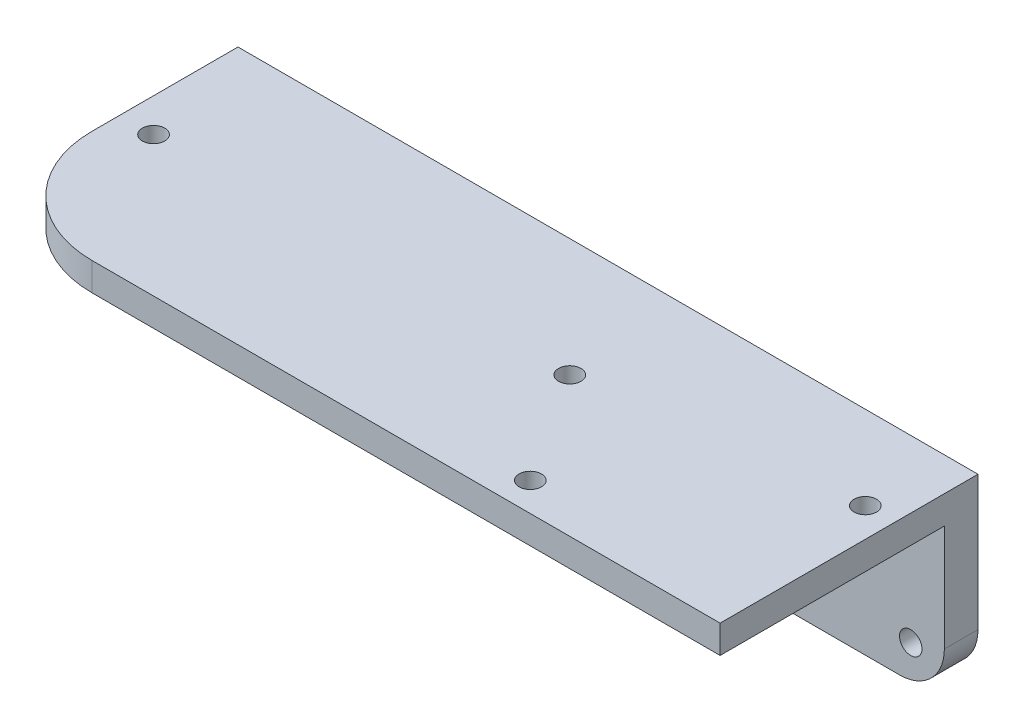
ISO-10303-21;
HEADER;
FILE_DESCRIPTION(('STEP AP214'),'2;1');
FILE_NAME('part.step','',(''),(''),'','','');
FILE_SCHEMA(('AUTOMOTIVE_DESIGN { 1 0 10303 214 1 1 1 1 }'));
ENDSEC;
DATA;
#1=APPLICATION_CONTEXT('core data for automotive mechanical design processes');
#2=APPLICATION_PROTOCOL_DEFINITION('international standard','automotive_design',2000,#1);
#3=PRODUCT_CONTEXT('',#1,'mechanical');
#4=PRODUCT('Part','Part','',(#3));
#5=PRODUCT_RELATED_PRODUCT_CATEGORY('part','',(#4));
#6=PRODUCT_DEFINITION_FORMATION('','',#4);
#7=PRODUCT_DEFINITION_CONTEXT('part definition',#1,'design');
#8=PRODUCT_DEFINITION('design','',#6,#7);
#9=PRODUCT_DEFINITION_SHAPE('','',#8);
#10=(LENGTH_UNIT() NAMED_UNIT(*) SI_UNIT(.MILLI.,.METRE.));
#11=(NAMED_UNIT(*) PLANE_ANGLE_UNIT() SI_UNIT($,.RADIAN.));
#12=(NAMED_UNIT(*) SI_UNIT($,.STERADIAN.) SOLID_ANGLE_UNIT());
#13=UNCERTAINTY_MEASURE_WITH_UNIT(LENGTH_MEASURE(1.E-05),#10,'distance_accuracy_value','');
#14=(GEOMETRIC_REPRESENTATION_CONTEXT(3) GLOBAL_UNCERTAINTY_ASSIGNED_CONTEXT((#13)) GLOBAL_UNIT_ASSIGNED_CONTEXT((#10,
#11,#12)) REPRESENTATION_CONTEXT('',''));
#15=CARTESIAN_POINT('',(0.,0.,0.));
#16=DIRECTION('',(0.,0.,1.));
#17=DIRECTION('',(1.,0.,0.));
#18=AXIS2_PLACEMENT_3D('',#15,#16,#17);
#19=CARTESIAN_POINT('',(0.,0.,3.));
#20=DIRECTION('',(0.,0.,-1.));
#21=DIRECTION('',(-1.,0.,0.));
#22=AXIS2_PLACEMENT_3D('',#19,#20,#21);
#23=PLANE('',#22);
#24=DIRECTION('',(-1.,0.,0.));
#25=VECTOR('',#24,1.);
#26=CARTESIAN_POINT('',(16.27,-5.,3.));
#27=LINE('',#26,#25);
#28=CARTESIAN_POINT('',(15.27,-5.,3.));
#29=VERTEX_POINT('',#28);
#30=CARTESIAN_POINT('',(9.27,-5.,3.));
#31=VERTEX_POINT('',#30);
#32=EDGE_CURVE('E509',#29,#31,#27,.T.);
#33=ORIENTED_EDGE('',*,*,#32,.T.);
#34=CARTESIAN_POINT('',(9.27,-4.,3.));
#35=DIRECTION('',(0.,0.,-1.));
#36=DIRECTION('',(-1.,0.,0.));
#37=AXIS2_PLACEMENT_3D('',#34,#35,#36);
#38=CIRCLE('',#37,1.);
#39=CARTESIAN_POINT('',(8.27,-4.,3.));
#40=VERTEX_POINT('',#39);
#41=EDGE_CURVE('E322',#31,#40,#38,.T.);
#42=ORIENTED_EDGE('',*,*,#41,.T.);
#43=DIRECTION('',(0.,1.,0.));
#44=VECTOR('',#43,1.);
#45=CARTESIAN_POINT('',(8.27,-5.,3.));
#46=LINE('',#45,#44);
#47=CARTESIAN_POINT('',(8.27,4.,3.));
#48=VERTEX_POINT('',#47);
#49=EDGE_CURVE('E511',#40,#48,#46,.T.);
#50=ORIENTED_EDGE('',*,*,#49,.T.);
#51=CARTESIAN_POINT('',(9.27,4.,3.));
#52=DIRECTION('',(0.,0.,-1.));
#53=DIRECTION('',(-1.,0.,0.));
#54=AXIS2_PLACEMENT_3D('',#51,#52,#53);
#55=CIRCLE('',#54,1.);
#56=CARTESIAN_POINT('',(9.27,5.,3.));
#57=VERTEX_POINT('',#56);
#58=EDGE_CURVE('E326',#48,#57,#55,.T.);
#59=ORIENTED_EDGE('',*,*,#58,.T.);
#60=DIRECTION('',(1.,0.,0.));
#61=VECTOR('',#60,1.);
#62=CARTESIAN_POINT('',(16.27,5.,3.));
#63=LINE('',#62,#61);
#64=CARTESIAN_POINT('',(15.27,5.,3.));
#65=VERTEX_POINT('',#64);
#66=EDGE_CURVE('E502',#57,#65,#63,.T.);
#67=ORIENTED_EDGE('',*,*,#66,.T.);
#68=CARTESIAN_POINT('',(15.27,4.,3.));
#69=DIRECTION('',(0.,0.,-1.));
#70=DIRECTION('',(-1.,0.,0.));
#71=AXIS2_PLACEMENT_3D('',#68,#69,#70);
#72=CIRCLE('',#71,1.);
#73=CARTESIAN_POINT('',(16.27,4.,3.));
#74=VERTEX_POINT('',#73);
#75=EDGE_CURVE('E318',#65,#74,#72,.T.);
#76=ORIENTED_EDGE('',*,*,#75,.T.);
#77=DIRECTION('',(0.,-1.,0.));
#78=VECTOR('',#77,1.);
#79=CARTESIAN_POINT('',(16.27,-5.,3.));
#80=LINE('',#79,#78);
#81=CARTESIAN_POINT('',(16.27,-4.,3.));
#82=VERTEX_POINT('',#81);
#83=EDGE_CURVE('E506',#74,#82,#80,.T.);
#84=ORIENTED_EDGE('',*,*,#83,.T.);
#85=CARTESIAN_POINT('',(15.27,-4.,3.));
#86=DIRECTION('',(0.,0.,-1.));
#87=DIRECTION('',(-1.,0.,0.));
#88=AXIS2_PLACEMENT_3D('',#85,#86,#87);
#89=CIRCLE('',#88,1.);
#90=EDGE_CURVE('E314',#82,#29,#89,.T.);
#91=ORIENTED_EDGE('',*,*,#90,.T.);
#92=EDGE_LOOP('',(#33,#42,#50,#59,#67,#76,#84,#91));
#93=FACE_BOUND('',#92,.T.);
#94=CARTESIAN_POINT('',(-30.,-5.,3.));
#95=DIRECTION('',(0.,0.,1.));
#96=DIRECTION('',(1.,0.,0.));
#97=AXIS2_PLACEMENT_3D('',#94,#95,#96);
#98=CIRCLE('',#97,1.);
#99=CARTESIAN_POINT('',(-29.,-5.,3.));
#100=VERTEX_POINT('',#99);
#101=EDGE_CURVE('E496',#100,#100,#98,.T.);
#102=ORIENTED_EDGE('',*,*,#101,.F.);
#103=EDGE_LOOP('',(#102));
#104=FACE_BOUND('',#103,.T.);
#105=DIRECTION('',(-1.,0.,0.));
#106=VECTOR('',#105,1.);
#107=CARTESIAN_POINT('',(-16.27,5.,3.));
#108=LINE('',#107,#106);
#109=CARTESIAN_POINT('',(-9.27,5.,3.));
#110=VERTEX_POINT('',#109);
#111=CARTESIAN_POINT('',(-15.27,5.,3.));
#112=VERTEX_POINT('',#111);
#113=EDGE_CURVE('E344',#110,#112,#108,.T.);
#114=ORIENTED_EDGE('',*,*,#113,.F.);
#115=CARTESIAN_POINT('',(-9.27,4.,3.));
#116=DIRECTION('',(0.,0.,-1.));
#117=DIRECTION('',(-1.,0.,0.));
#118=AXIS2_PLACEMENT_3D('',#115,#116,#117);
#119=CIRCLE('',#118,1.);
#120=CARTESIAN_POINT('',(-8.27,4.,3.));
#121=VERTEX_POINT('',#120);
#122=EDGE_CURVE('E338',#110,#121,#119,.T.);
#123=ORIENTED_EDGE('',*,*,#122,.T.);
#124=DIRECTION('',(0.,1.,0.));
#125=VECTOR('',#124,1.);
#126=CARTESIAN_POINT('',(-8.27,-5.,3.));
#127=LINE('',#126,#125);
#128=CARTESIAN_POINT('',(-8.27,-4.,3.));
#129=VERTEX_POINT('',#128);
#130=EDGE_CURVE('E351',#129,#121,#127,.T.);
#131=ORIENTED_EDGE('',*,*,#130,.F.);
#132=CARTESIAN_POINT('',(-9.27,-4.,3.));
#133=DIRECTION('',(0.,0.,-1.));
#134=DIRECTION('',(-1.,0.,0.));
#135=AXIS2_PLACEMENT_3D('',#132,#133,#134);
#136=CIRCLE('',#135,1.);
#137=CARTESIAN_POINT('',(-9.27,-5.,3.));
#138=VERTEX_POINT('',#137);
#139=EDGE_CURVE('E330',#129,#138,#136,.T.);
#140=ORIENTED_EDGE('',*,*,#139,.T.);
#141=DIRECTION('',(1.,0.,0.));
#142=VECTOR('',#141,1.);
#143=CARTESIAN_POINT('',(-16.27,-5.,3.));
#144=LINE('',#143,#142);
#145=CARTESIAN_POINT('',(-15.27,-5.,3.));
#146=VERTEX_POINT('',#145);
#147=EDGE_CURVE('E377',#146,#138,#144,.T.);
#148=ORIENTED_EDGE('',*,*,#147,.F.);
#149=CARTESIAN_POINT('',(-15.27,-4.,3.));
#150=DIRECTION('',(0.,0.,-1.));
#151=DIRECTION('',(-1.,0.,0.));
#152=AXIS2_PLACEMENT_3D('',#149,#150,#151);
#153=CIRCLE('',#152,1.);
#154=CARTESIAN_POINT('',(-16.27,-4.,3.));
#155=VERTEX_POINT('',#154);
#156=EDGE_CURVE('E334',#146,#155,#153,.T.);
#157=ORIENTED_EDGE('',*,*,#156,.T.);
#158=DIRECTION('',(0.,-1.,0.));
#159=VECTOR('',#158,1.);
#160=CARTESIAN_POINT('',(-16.27,-5.,3.));
#161=LINE('',#160,#159);
#162=CARTESIAN_POINT('',(-16.27,4.,3.));
#163=VERTEX_POINT('',#162);
#164=EDGE_CURVE('E346',#163,#155,#161,.T.);
#165=ORIENTED_EDGE('',*,*,#164,.F.);
#166=CARTESIAN_POINT('',(-15.27,4.,3.));
#167=DIRECTION('',(0.,0.,-1.));
#168=DIRECTION('',(-1.,0.,0.));
#169=AXIS2_PLACEMENT_3D('',#166,#167,#168);
#170=CIRCLE('',#169,1.);
#171=EDGE_CURVE('E41',#163,#112,#170,.T.);
#172=ORIENTED_EDGE('',*,*,#171,.T.);
#173=EDGE_LOOP('',(#114,#123,#131,#140,#148,#157,#165,#172));
#174=FACE_BOUND('',#173,.T.);
#175=DIRECTION('',(1.,0.,0.));
#176=VECTOR('',#175,1.);
#177=CARTESIAN_POINT('',(-33.,-8.,3.));
#178=LINE('',#177,#176);
#179=CARTESIAN_POINT('',(-29.,-8.,3.));
#180=VERTEX_POINT('',#179);
#181=CARTESIAN_POINT('',(29.,-8.,3.));
#182=VERTEX_POINT('',#181);
#183=EDGE_CURVE('E593',#180,#182,#178,.T.);
#184=ORIENTED_EDGE('',*,*,#183,.T.);
#185=CARTESIAN_POINT('',(29.,-4.,3.));
#186=DIRECTION('',(0.,0.,-1.));
#187=DIRECTION('',(-1.,0.,0.));
#188=AXIS2_PLACEMENT_3D('',#185,#186,#187);
#189=CIRCLE('',#188,4.);
#190=CARTESIAN_POINT('',(33.,-4.,3.));
#191=VERTEX_POINT('',#190);
#192=EDGE_CURVE('E271',#182,#191,#189,.F.);
#193=ORIENTED_EDGE('',*,*,#192,.T.);
#194=DIRECTION('',(0.,1.,0.));
#195=VECTOR('',#194,1.);
#196=CARTESIAN_POINT('',(33.,-8.,3.));
#197=LINE('',#196,#195);
#198=CARTESIAN_POINT('',(33.,5.5,3.));
#199=VERTEX_POINT('',#198);
#200=EDGE_CURVE('E255',#191,#199,#197,.T.);
#201=ORIENTED_EDGE('',*,*,#200,.T.);
#202=DIRECTION('',(1.,0.,0.));
#203=VECTOR('',#202,1.);
#204=CARTESIAN_POINT('',(-33.,5.5,3.));
#205=LINE('',#204,#203);
#206=CARTESIAN_POINT('',(-33.,5.5,3.));
#207=VERTEX_POINT('',#206);
#208=EDGE_CURVE('E212',#207,#199,#205,.T.);
#209=ORIENTED_EDGE('',*,*,#208,.F.);
#210=DIRECTION('',(0.,-1.,0.));
#211=VECTOR('',#210,1.);
#212=CARTESIAN_POINT('',(-33.,-8.,3.));
#213=LINE('',#212,#211);
#214=CARTESIAN_POINT('',(-33.,-4.,3.));
#215=VERTEX_POINT('',#214);
#216=EDGE_CURVE('E238',#207,#215,#213,.T.);
#217=ORIENTED_EDGE('',*,*,#216,.T.);
#218=CARTESIAN_POINT('',(-29.,-4.,3.));
#219=DIRECTION('',(0.,0.,-1.));
#220=DIRECTION('',(-1.,0.,0.));
#221=AXIS2_PLACEMENT_3D('',#218,#219,#220);
#222=CIRCLE('',#221,4.);
#223=EDGE_CURVE('E269',#215,#180,#222,.F.);
#224=ORIENTED_EDGE('',*,*,#223,.T.);
#225=EDGE_LOOP('',(#184,#193,#201,#209,#217,#224));
#226=FACE_BOUND('',#225,.T.);
#227=CARTESIAN_POINT('',(30.,-5.,3.));
#228=DIRECTION('',(0.,0.,-1.));
#229=DIRECTION('',(-1.,0.,0.));
#230=AXIS2_PLACEMENT_3D('',#227,#228,#229);
#231=CIRCLE('',#230,1.);
#232=CARTESIAN_POINT('',(29.,-5.,3.));
#233=VERTEX_POINT('',#232);
#234=EDGE_CURVE('E525',#233,#233,#231,.T.);
#235=ORIENTED_EDGE('',*,*,#234,.T.);
#236=EDGE_LOOP('',(#235));
#237=FACE_BOUND('',#236,.T.);
#238=ADVANCED_FACE('F33',(#93,#104,#174,#226,#237),#23,.F.);
#239=CARTESIAN_POINT('',(0.,0.,0.));
#240=DIRECTION('',(0.,0.,-1.));
#241=DIRECTION('',(-1.,0.,0.));
#242=AXIS2_PLACEMENT_3D('',#239,#240,#241);
#243=PLANE('',#242);
#244=DIRECTION('',(1.,0.,0.));
#245=VECTOR('',#244,1.);
#246=CARTESIAN_POINT('',(16.27,5.,0.));
#247=LINE('',#246,#245);
#248=CARTESIAN_POINT('',(9.27,5.,0.));
#249=VERTEX_POINT('',#248);
#250=CARTESIAN_POINT('',(15.27,5.,0.));
#251=VERTEX_POINT('',#250);
#252=EDGE_CURVE('E499',#249,#251,#247,.T.);
#253=ORIENTED_EDGE('',*,*,#252,.F.);
#254=CARTESIAN_POINT('',(9.27,4.,0.));
#255=DIRECTION('',(0.,0.,-1.));
#256=DIRECTION('',(-1.,0.,0.));
#257=AXIS2_PLACEMENT_3D('',#254,#255,#256);
#258=CIRCLE('',#257,1.);
#259=CARTESIAN_POINT('',(8.27,4.,0.));
#260=VERTEX_POINT('',#259);
#261=EDGE_CURVE('E328',#249,#260,#258,.F.);
#262=ORIENTED_EDGE('',*,*,#261,.T.);
#263=DIRECTION('',(0.,1.,0.));
#264=VECTOR('',#263,1.);
#265=CARTESIAN_POINT('',(8.27,-5.,0.));
#266=LINE('',#265,#264);
#267=CARTESIAN_POINT('',(8.27,-4.,0.));
#268=VERTEX_POINT('',#267);
#269=EDGE_CURVE('E505',#268,#260,#266,.T.);
#270=ORIENTED_EDGE('',*,*,#269,.F.);
#271=CARTESIAN_POINT('',(9.27,-4.,0.));
#272=DIRECTION('',(0.,0.,-1.));
#273=DIRECTION('',(-1.,0.,0.));
#274=AXIS2_PLACEMENT_3D('',#271,#272,#273);
#275=CIRCLE('',#274,1.);
#276=CARTESIAN_POINT('',(9.27,-5.,0.));
#277=VERTEX_POINT('',#276);
#278=EDGE_CURVE('E324',#268,#277,#275,.F.);
#279=ORIENTED_EDGE('',*,*,#278,.T.);
#280=DIRECTION('',(-1.,0.,0.));
#281=VECTOR('',#280,1.);
#282=CARTESIAN_POINT('',(16.27,-5.,0.));
#283=LINE('',#282,#281);
#284=CARTESIAN_POINT('',(15.27,-5.,0.));
#285=VERTEX_POINT('',#284);
#286=EDGE_CURVE('E520',#285,#277,#283,.T.);
#287=ORIENTED_EDGE('',*,*,#286,.F.);
#288=CARTESIAN_POINT('',(15.27,-4.,0.));
#289=DIRECTION('',(0.,0.,-1.));
#290=DIRECTION('',(-1.,0.,0.));
#291=AXIS2_PLACEMENT_3D('',#288,#289,#290);
#292=CIRCLE('',#291,1.);
#293=CARTESIAN_POINT('',(16.27,-4.,0.));
#294=VERTEX_POINT('',#293);
#295=EDGE_CURVE('E316',#285,#294,#292,.F.);
#296=ORIENTED_EDGE('',*,*,#295,.T.);
#297=DIRECTION('',(0.,-1.,0.));
#298=VECTOR('',#297,1.);
#299=CARTESIAN_POINT('',(16.27,-5.,0.));
#300=LINE('',#299,#298);
#301=CARTESIAN_POINT('',(16.27,4.,0.));
#302=VERTEX_POINT('',#301);
#303=EDGE_CURVE('E517',#302,#294,#300,.T.);
#304=ORIENTED_EDGE('',*,*,#303,.F.);
#305=CARTESIAN_POINT('',(15.27,4.,0.));
#306=DIRECTION('',(0.,0.,-1.));
#307=DIRECTION('',(-1.,0.,0.));
#308=AXIS2_PLACEMENT_3D('',#305,#306,#307);
#309=CIRCLE('',#308,1.);
#310=EDGE_CURVE('E320',#302,#251,#309,.F.);
#311=ORIENTED_EDGE('',*,*,#310,.T.);
#312=EDGE_LOOP('',(#253,#262,#270,#279,#287,#296,#304,#311));
#313=FACE_BOUND('',#312,.T.);
#314=CARTESIAN_POINT('',(-30.,-5.,0.));
#315=DIRECTION('',(0.,0.,1.));
#316=DIRECTION('',(1.,0.,0.));
#317=AXIS2_PLACEMENT_3D('',#314,#315,#316);
#318=CIRCLE('',#317,1.);
#319=CARTESIAN_POINT('',(-29.,-5.,0.));
#320=VERTEX_POINT('',#319);
#321=EDGE_CURVE('E374',#320,#320,#318,.T.);
#322=ORIENTED_EDGE('',*,*,#321,.T.);
#323=EDGE_LOOP('',(#322));
#324=FACE_BOUND('',#323,.T.);
#325=DIRECTION('',(1.,0.,0.));
#326=VECTOR('',#325,1.);
#327=CARTESIAN_POINT('',(-16.27,-5.,0.));
#328=LINE('',#327,#326);
#329=CARTESIAN_POINT('',(-15.27,-5.,0.));
#330=VERTEX_POINT('',#329);
#331=CARTESIAN_POINT('',(-9.27,-5.,0.));
#332=VERTEX_POINT('',#331);
#333=EDGE_CURVE('E365',#330,#332,#328,.T.);
#334=ORIENTED_EDGE('',*,*,#333,.T.);
#335=CARTESIAN_POINT('',(-9.27,-4.,0.));
#336=DIRECTION('',(0.,0.,-1.));
#337=DIRECTION('',(-1.,0.,0.));
#338=AXIS2_PLACEMENT_3D('',#335,#336,#337);
#339=CIRCLE('',#338,1.);
#340=CARTESIAN_POINT('',(-8.27,-4.,0.));
#341=VERTEX_POINT('',#340);
#342=EDGE_CURVE('E332',#332,#341,#339,.F.);
#343=ORIENTED_EDGE('',*,*,#342,.T.);
#344=DIRECTION('',(0.,1.,0.));
#345=VECTOR('',#344,1.);
#346=CARTESIAN_POINT('',(-8.27,-5.,0.));
#347=LINE('',#346,#345);
#348=CARTESIAN_POINT('',(-8.27,4.,0.));
#349=VERTEX_POINT('',#348);
#350=EDGE_CURVE('E369',#341,#349,#347,.T.);
#351=ORIENTED_EDGE('',*,*,#350,.T.);
#352=CARTESIAN_POINT('',(-9.27,4.,0.));
#353=DIRECTION('',(0.,0.,-1.));
#354=DIRECTION('',(-1.,0.,0.));
#355=AXIS2_PLACEMENT_3D('',#352,#353,#354);
#356=CIRCLE('',#355,1.);
#357=CARTESIAN_POINT('',(-9.27,5.,0.));
#358=VERTEX_POINT('',#357);
#359=EDGE_CURVE('E55',#349,#358,#356,.F.);
#360=ORIENTED_EDGE('',*,*,#359,.T.);
#361=DIRECTION('',(-1.,0.,0.));
#362=VECTOR('',#361,1.);
#363=CARTESIAN_POINT('',(-16.27,5.,0.));
#364=LINE('',#363,#362);
#365=CARTESIAN_POINT('',(-15.27,5.,0.));
#366=VERTEX_POINT('',#365);
#367=EDGE_CURVE('E361',#358,#366,#364,.T.);
#368=ORIENTED_EDGE('',*,*,#367,.T.);
#369=CARTESIAN_POINT('',(-15.27,4.,0.));
#370=DIRECTION('',(0.,0.,-1.));
#371=DIRECTION('',(-1.,0.,0.));
#372=AXIS2_PLACEMENT_3D('',#369,#370,#371);
#373=CIRCLE('',#372,1.);
#374=CARTESIAN_POINT('',(-16.27,4.,0.));
#375=VERTEX_POINT('',#374);
#376=EDGE_CURVE('E11',#366,#375,#373,.F.);
#377=ORIENTED_EDGE('',*,*,#376,.T.);
#378=DIRECTION('',(0.,-1.,0.));
#379=VECTOR('',#378,1.);
#380=CARTESIAN_POINT('',(-16.27,-5.,0.));
#381=LINE('',#380,#379);
#382=CARTESIAN_POINT('',(-16.27,-4.,0.));
#383=VERTEX_POINT('',#382);
#384=EDGE_CURVE('E359',#375,#383,#381,.T.);
#385=ORIENTED_EDGE('',*,*,#384,.T.);
#386=CARTESIAN_POINT('',(-15.27,-4.,0.));
#387=DIRECTION('',(0.,0.,-1.));
#388=DIRECTION('',(-1.,0.,0.));
#389=AXIS2_PLACEMENT_3D('',#386,#387,#388);
#390=CIRCLE('',#389,1.);
#391=EDGE_CURVE('E336',#383,#330,#390,.F.);
#392=ORIENTED_EDGE('',*,*,#391,.T.);
#393=EDGE_LOOP('',(#334,#343,#351,#360,#368,#377,#385,#392));
#394=FACE_BOUND('',#393,.T.);
#395=DIRECTION('',(0.,1.,0.));
#396=VECTOR('',#395,1.);
#397=CARTESIAN_POINT('',(33.,-8.,0.));
#398=LINE('',#397,#396);
#399=CARTESIAN_POINT('',(33.,-4.,0.));
#400=VERTEX_POINT('',#399);
#401=CARTESIAN_POINT('',(33.,8.,0.));
#402=VERTEX_POINT('',#401);
#403=EDGE_CURVE('E247',#400,#402,#398,.T.);
#404=ORIENTED_EDGE('',*,*,#403,.F.);
#405=CARTESIAN_POINT('',(29.,-4.,0.));
#406=DIRECTION('',(0.,0.,-1.));
#407=DIRECTION('',(-1.,0.,0.));
#408=AXIS2_PLACEMENT_3D('',#405,#406,#407);
#409=CIRCLE('',#408,4.);
#410=CARTESIAN_POINT('',(29.,-8.,0.));
#411=VERTEX_POINT('',#410);
#412=EDGE_CURVE('E262',#400,#411,#409,.T.);
#413=ORIENTED_EDGE('',*,*,#412,.T.);
#414=DIRECTION('',(1.,0.,0.));
#415=VECTOR('',#414,1.);
#416=CARTESIAN_POINT('',(-33.,-8.,0.));
#417=LINE('',#416,#415);
#418=CARTESIAN_POINT('',(-29.,-8.,0.));
#419=VERTEX_POINT('',#418);
#420=EDGE_CURVE('E257',#419,#411,#417,.T.);
#421=ORIENTED_EDGE('',*,*,#420,.F.);
#422=CARTESIAN_POINT('',(-29.,-4.,0.));
#423=DIRECTION('',(0.,0.,-1.));
#424=DIRECTION('',(-1.,0.,0.));
#425=AXIS2_PLACEMENT_3D('',#422,#423,#424);
#426=CIRCLE('',#425,4.);
#427=CARTESIAN_POINT('',(-33.,-4.,0.));
#428=VERTEX_POINT('',#427);
#429=EDGE_CURVE('E260',#419,#428,#426,.T.);
#430=ORIENTED_EDGE('',*,*,#429,.T.);
#431=DIRECTION('',(0.,-1.,0.));
#432=VECTOR('',#431,1.);
#433=CARTESIAN_POINT('',(-33.,-8.,0.));
#434=LINE('',#433,#432);
#435=CARTESIAN_POINT('',(-33.,8.,0.));
#436=VERTEX_POINT('',#435);
#437=EDGE_CURVE('E599',#436,#428,#434,.T.);
#438=ORIENTED_EDGE('',*,*,#437,.F.);
#439=DIRECTION('',(-1.,0.,0.));
#440=VECTOR('',#439,1.);
#441=CARTESIAN_POINT('',(-33.,8.,0.));
#442=LINE('',#441,#440);
#443=EDGE_CURVE('E590',#402,#436,#442,.T.);
#444=ORIENTED_EDGE('',*,*,#443,.F.);
#445=EDGE_LOOP('',(#404,#413,#421,#430,#438,#444));
#446=FACE_BOUND('',#445,.T.);
#447=CARTESIAN_POINT('',(30.,-5.,0.));
#448=DIRECTION('',(0.,0.,-1.));
#449=DIRECTION('',(-1.,0.,0.));
#450=AXIS2_PLACEMENT_3D('',#447,#448,#449);
#451=CIRCLE('',#450,1.);
#452=CARTESIAN_POINT('',(29.,-5.,0.));
#453=VERTEX_POINT('',#452);
#454=EDGE_CURVE('E514',#453,#453,#451,.T.);
#455=ORIENTED_EDGE('',*,*,#454,.F.);
#456=EDGE_LOOP('',(#455));
#457=FACE_BOUND('',#456,.T.);
#458=ADVANCED_FACE('F357',(#313,#324,#394,#446,#457),#243,.T.);
#459=CARTESIAN_POINT('',(33.,-8.,3.));
#460=DIRECTION('',(-1.,0.,0.));
#461=DIRECTION('',(0.,0.,1.));
#462=AXIS2_PLACEMENT_3D('',#459,#460,#461);
#463=PLANE('',#462);
#464=ORIENTED_EDGE('',*,*,#200,.F.);
#465=DIRECTION('',(0.,0.,-1.));
#466=VECTOR('',#465,1.);
#467=CARTESIAN_POINT('',(33.,-4.,3.));
#468=LINE('',#467,#466);
#469=EDGE_CURVE('E254',#191,#400,#468,.T.);
#470=ORIENTED_EDGE('',*,*,#469,.T.);
#471=ORIENTED_EDGE('',*,*,#403,.T.);
#472=DIRECTION('',(0.,0.,-1.));
#473=VECTOR('',#472,1.);
#474=CARTESIAN_POINT('',(33.,8.,3.));
#475=LINE('',#474,#473);
#476=CARTESIAN_POINT('',(33.,8.,23.));
#477=VERTEX_POINT('',#476);
#478=EDGE_CURVE('E226',#477,#402,#475,.T.);
#479=ORIENTED_EDGE('',*,*,#478,.F.);
#480=DIRECTION('',(0.,1.,0.));
#481=VECTOR('',#480,1.);
#482=CARTESIAN_POINT('',(33.,8.,23.));
#483=LINE('',#482,#481);
#484=CARTESIAN_POINT('',(33.,5.5,23.));
#485=VERTEX_POINT('',#484);
#486=EDGE_CURVE('E207',#485,#477,#483,.T.);
#487=ORIENTED_EDGE('',*,*,#486,.F.);
#488=DIRECTION('',(0.,0.,-1.));
#489=VECTOR('',#488,1.);
#490=CARTESIAN_POINT('',(33.,5.5,23.));
#491=LINE('',#490,#489);
#492=EDGE_CURVE('E216',#485,#199,#491,.T.);
#493=ORIENTED_EDGE('',*,*,#492,.T.);
#494=EDGE_LOOP('',(#464,#470,#471,#479,#487,#493));
#495=FACE_BOUND('',#494,.T.);
#496=ADVANCED_FACE('F224',(#495),#463,.F.);
#497=CARTESIAN_POINT('',(-33.,8.,3.));
#498=DIRECTION('',(0.,-1.,0.));
#499=DIRECTION('',(0.,0.,-1.));
#500=AXIS2_PLACEMENT_3D('',#497,#498,#499);
#501=PLANE('',#500);
#502=CARTESIAN_POINT('',(13.51,8.,20.44));
#503=DIRECTION('',(0.,-1.,0.));
#504=DIRECTION('',(0.,0.,-1.));
#505=AXIS2_PLACEMENT_3D('',#502,#503,#504);
#506=CIRCLE('',#505,1.);
#507=CARTESIAN_POINT('',(13.51,8.,19.44));
#508=VERTEX_POINT('',#507);
#509=EDGE_CURVE('E380',#508,#508,#506,.T.);
#510=ORIENTED_EDGE('',*,*,#509,.T.);
#511=EDGE_LOOP('',(#510));
#512=FACE_BOUND('',#511,.T.);
#513=CARTESIAN_POINT('',(30.4,8.,7.45));
#514=DIRECTION('',(0.,-1.,0.));
#515=DIRECTION('',(0.,0.,-1.));
#516=AXIS2_PLACEMENT_3D('',#513,#514,#515);
#517=CIRCLE('',#516,0.999999999999998);
#518=CARTESIAN_POINT('',(30.4,8.,6.45));
#519=VERTEX_POINT('',#518);
#520=EDGE_CURVE('E386',#519,#519,#517,.T.);
#521=ORIENTED_EDGE('',*,*,#520,.T.);
#522=EDGE_LOOP('',(#521));
#523=FACE_BOUND('',#522,.T.);
#524=CARTESIAN_POINT('',(7.12000000000001,8.,10.53));
#525=DIRECTION('',(0.,-1.,0.));
#526=DIRECTION('',(0.,0.,-1.));
#527=AXIS2_PLACEMENT_3D('',#524,#525,#526);
#528=CIRCLE('',#527,1.);
#529=CARTESIAN_POINT('',(7.12000000000001,8.,9.53));
#530=VERTEX_POINT('',#529);
#531=EDGE_CURVE('E392',#530,#530,#528,.T.);
#532=ORIENTED_EDGE('',*,*,#531,.T.);
#533=EDGE_LOOP('',(#532));
#534=FACE_BOUND('',#533,.T.);
#535=CARTESIAN_POINT('',(-30.,8.,10.53));
#536=DIRECTION('',(0.,-1.,0.));
#537=DIRECTION('',(0.,0.,-1.));
#538=AXIS2_PLACEMENT_3D('',#535,#536,#537);
#539=CIRCLE('',#538,0.999999999999998);
#540=CARTESIAN_POINT('',(-30.,8.,9.53));
#541=VERTEX_POINT('',#540);
#542=EDGE_CURVE('E237',#541,#541,#539,.T.);
#543=ORIENTED_EDGE('',*,*,#542,.T.);
#544=EDGE_LOOP('',(#543));
#545=FACE_BOUND('',#544,.T.);
#546=DIRECTION('',(0.,0.,-1.));
#547=VECTOR('',#546,1.);
#548=CARTESIAN_POINT('',(-33.,8.,3.));
#549=LINE('',#548,#547);
#550=CARTESIAN_POINT('',(-33.,8.,13.));
#551=VERTEX_POINT('',#550);
#552=EDGE_CURVE('E587',#551,#436,#549,.T.);
#553=ORIENTED_EDGE('',*,*,#552,.F.);
#554=CARTESIAN_POINT('',(-23.,8.,13.));
#555=DIRECTION('',(0.,-1.,0.));
#556=DIRECTION('',(0.,0.,-1.));
#557=AXIS2_PLACEMENT_3D('',#554,#555,#556);
#558=CIRCLE('',#557,10.);
#559=CARTESIAN_POINT('',(-23.,8.,23.));
#560=VERTEX_POINT('',#559);
#561=EDGE_CURVE('E252',#551,#560,#558,.F.);
#562=ORIENTED_EDGE('',*,*,#561,.T.);
#563=DIRECTION('',(-1.,0.,0.));
#564=VECTOR('',#563,1.);
#565=CARTESIAN_POINT('',(-33.,8.,23.));
#566=LINE('',#565,#564);
#567=EDGE_CURVE('E222',#477,#560,#566,.T.);
#568=ORIENTED_EDGE('',*,*,#567,.F.);
#569=ORIENTED_EDGE('',*,*,#478,.T.);
#570=ORIENTED_EDGE('',*,*,#443,.T.);
#571=EDGE_LOOP('',(#553,#562,#568,#569,#570));
#572=FACE_BOUND('',#571,.T.);
#573=ADVANCED_FACE('F431',(#512,#523,#534,#545,#572),#501,.F.);
#574=CARTESIAN_POINT('',(-33.,-8.,3.));
#575=DIRECTION('',(1.,0.,0.));
#576=DIRECTION('',(0.,0.,-1.));
#577=AXIS2_PLACEMENT_3D('',#574,#575,#576);
#578=PLANE('',#577);
#579=ORIENTED_EDGE('',*,*,#437,.T.);
#580=DIRECTION('',(0.,0.,-1.));
#581=VECTOR('',#580,1.);
#582=CARTESIAN_POINT('',(-33.,-4.,3.));
#583=LINE('',#582,#581);
#584=EDGE_CURVE('E273',#428,#215,#583,.F.);
#585=ORIENTED_EDGE('',*,*,#584,.T.);
#586=ORIENTED_EDGE('',*,*,#216,.F.);
#587=DIRECTION('',(0.,0.,-1.));
#588=VECTOR('',#587,1.);
#589=CARTESIAN_POINT('',(-33.,5.5,23.));
#590=LINE('',#589,#588);
#591=CARTESIAN_POINT('',(-33.,5.5,13.));
#592=VERTEX_POINT('',#591);
#593=EDGE_CURVE('E221',#592,#207,#590,.T.);
#594=ORIENTED_EDGE('',*,*,#593,.F.);
#595=DIRECTION('',(0.,-1.,0.));
#596=VECTOR('',#595,1.);
#597=CARTESIAN_POINT('',(-33.,8.,13.));
#598=LINE('',#597,#596);
#599=EDGE_CURVE('E250',#592,#551,#598,.F.);
#600=ORIENTED_EDGE('',*,*,#599,.T.);
#601=ORIENTED_EDGE('',*,*,#552,.T.);
#602=EDGE_LOOP('',(#579,#585,#586,#594,#600,#601));
#603=FACE_BOUND('',#602,.T.);
#604=ADVANCED_FACE('F413',(#603),#578,.F.);
#605=CARTESIAN_POINT('',(-33.,-8.,3.));
#606=DIRECTION('',(0.,1.,0.));
#607=DIRECTION('',(0.,0.,1.));
#608=AXIS2_PLACEMENT_3D('',#605,#606,#607);
#609=PLANE('',#608);
#610=ORIENTED_EDGE('',*,*,#420,.T.);
#611=DIRECTION('',(0.,0.,-1.));
#612=VECTOR('',#611,1.);
#613=CARTESIAN_POINT('',(29.,-8.,3.));
#614=LINE('',#613,#612);
#615=EDGE_CURVE('E267',#411,#182,#614,.F.);
#616=ORIENTED_EDGE('',*,*,#615,.T.);
#617=ORIENTED_EDGE('',*,*,#183,.F.);
#618=DIRECTION('',(0.,0.,-1.));
#619=VECTOR('',#618,1.);
#620=CARTESIAN_POINT('',(-29.,-8.,3.));
#621=LINE('',#620,#619);
#622=EDGE_CURVE('E264',#180,#419,#621,.T.);
#623=ORIENTED_EDGE('',*,*,#622,.T.);
#624=EDGE_LOOP('',(#610,#616,#617,#623));
#625=FACE_BOUND('',#624,.T.);
#626=ADVANCED_FACE('F405',(#625),#609,.F.);
#627=CARTESIAN_POINT('',(-33.,5.5,23.));
#628=DIRECTION('',(0.,1.,0.));
#629=DIRECTION('',(0.,0.,1.));
#630=AXIS2_PLACEMENT_3D('',#627,#628,#629);
#631=PLANE('',#630);
#632=CARTESIAN_POINT('',(13.51,5.5,20.44));
#633=DIRECTION('',(0.,-1.,0.));
#634=DIRECTION('',(0.,0.,-1.));
#635=AXIS2_PLACEMENT_3D('',#632,#633,#634);
#636=CIRCLE('',#635,1.);
#637=CARTESIAN_POINT('',(13.51,5.5,19.44));
#638=VERTEX_POINT('',#637);
#639=EDGE_CURVE('E367',#638,#638,#636,.T.);
#640=ORIENTED_EDGE('',*,*,#639,.F.);
#641=EDGE_LOOP('',(#640));
#642=FACE_BOUND('',#641,.T.);
#643=CARTESIAN_POINT('',(30.4,5.5,7.45));
#644=DIRECTION('',(0.,-1.,0.));
#645=DIRECTION('',(0.,0.,-1.));
#646=AXIS2_PLACEMENT_3D('',#643,#644,#645);
#647=CIRCLE('',#646,0.999999999999998);
#648=CARTESIAN_POINT('',(30.4,5.5,6.45));
#649=VERTEX_POINT('',#648);
#650=EDGE_CURVE('E383',#649,#649,#647,.T.);
#651=ORIENTED_EDGE('',*,*,#650,.F.);
#652=EDGE_LOOP('',(#651));
#653=FACE_BOUND('',#652,.T.);
#654=CARTESIAN_POINT('',(7.12000000000001,5.5,10.53));
#655=DIRECTION('',(0.,-1.,0.));
#656=DIRECTION('',(0.,0.,-1.));
#657=AXIS2_PLACEMENT_3D('',#654,#655,#656);
#658=CIRCLE('',#657,1.);
#659=CARTESIAN_POINT('',(7.12000000000001,5.5,9.53));
#660=VERTEX_POINT('',#659);
#661=EDGE_CURVE('E389',#660,#660,#658,.T.);
#662=ORIENTED_EDGE('',*,*,#661,.F.);
#663=EDGE_LOOP('',(#662));
#664=FACE_BOUND('',#663,.T.);
#665=CARTESIAN_POINT('',(-30.,5.5,10.53));
#666=DIRECTION('',(0.,-1.,0.));
#667=DIRECTION('',(0.,0.,-1.));
#668=AXIS2_PLACEMENT_3D('',#665,#666,#667);
#669=CIRCLE('',#668,0.999999999999998);
#670=CARTESIAN_POINT('',(-30.,5.5,9.53));
#671=VERTEX_POINT('',#670);
#672=EDGE_CURVE('E395',#671,#671,#669,.T.);
#673=ORIENTED_EDGE('',*,*,#672,.F.);
#674=EDGE_LOOP('',(#673));
#675=FACE_BOUND('',#674,.T.);
#676=DIRECTION('',(1.,0.,0.));
#677=VECTOR('',#676,1.);
#678=CARTESIAN_POINT('',(-33.,5.5,23.));
#679=LINE('',#678,#677);
#680=CARTESIAN_POINT('',(-23.,5.5,23.));
#681=VERTEX_POINT('',#680);
#682=EDGE_CURVE('E202',#681,#485,#679,.T.);
#683=ORIENTED_EDGE('',*,*,#682,.F.);
#684=CARTESIAN_POINT('',(-23.,5.5,13.));
#685=DIRECTION('',(0.,1.,0.));
#686=DIRECTION('',(0.,0.,1.));
#687=AXIS2_PLACEMENT_3D('',#684,#685,#686);
#688=CIRCLE('',#687,10.);
#689=EDGE_CURVE('E248',#681,#592,#688,.F.);
#690=ORIENTED_EDGE('',*,*,#689,.T.);
#691=ORIENTED_EDGE('',*,*,#593,.T.);
#692=ORIENTED_EDGE('',*,*,#208,.T.);
#693=ORIENTED_EDGE('',*,*,#492,.F.);
#694=EDGE_LOOP('',(#683,#690,#691,#692,#693));
#695=FACE_BOUND('',#694,.T.);
#696=ADVANCED_FACE('F217',(#642,#653,#664,#675,#695),#631,.F.);
#697=CARTESIAN_POINT('',(0.,0.,23.));
#698=DIRECTION('',(0.,0.,1.));
#699=DIRECTION('',(1.,0.,0.));
#700=AXIS2_PLACEMENT_3D('',#697,#698,#699);
#701=PLANE('',#700);
#702=ORIENTED_EDGE('',*,*,#567,.T.);
#703=DIRECTION('',(0.,-1.,0.));
#704=VECTOR('',#703,1.);
#705=CARTESIAN_POINT('',(-23.,5.5,23.));
#706=LINE('',#705,#704);
#707=EDGE_CURVE('E210',#560,#681,#706,.T.);
#708=ORIENTED_EDGE('',*,*,#707,.T.);
#709=ORIENTED_EDGE('',*,*,#682,.T.);
#710=ORIENTED_EDGE('',*,*,#486,.T.);
#711=EDGE_LOOP('',(#702,#708,#709,#710));
#712=FACE_BOUND('',#711,.T.);
#713=ADVANCED_FACE('F205',(#712),#701,.T.);
#714=CARTESIAN_POINT('',(-30.,8.,10.53));
#715=DIRECTION('',(0.,-1.,0.));
#716=DIRECTION('',(0.,0.,-1.));
#717=AXIS2_PLACEMENT_3D('',#714,#715,#716);
#718=CYLINDRICAL_SURFACE('',#717,0.999999999999998);
#719=ORIENTED_EDGE('',*,*,#542,.F.);
#720=EDGE_LOOP('',(#719));
#721=FACE_BOUND('',#720,.T.);
#722=ORIENTED_EDGE('',*,*,#672,.T.);
#723=EDGE_LOOP('',(#722));
#724=FACE_BOUND('',#723,.T.);
#725=ADVANCED_FACE('F402',(#721,#724),#718,.F.);
#726=CARTESIAN_POINT('',(7.12000000000001,8.,10.53));
#727=DIRECTION('',(0.,-1.,0.));
#728=DIRECTION('',(0.,0.,-1.));
#729=AXIS2_PLACEMENT_3D('',#726,#727,#728);
#730=CYLINDRICAL_SURFACE('',#729,1.);
#731=ORIENTED_EDGE('',*,*,#531,.F.);
#732=EDGE_LOOP('',(#731));
#733=FACE_BOUND('',#732,.T.);
#734=ORIENTED_EDGE('',*,*,#661,.T.);
#735=EDGE_LOOP('',(#734));
#736=FACE_BOUND('',#735,.T.);
#737=ADVANCED_FACE('F573',(#733,#736),#730,.F.);
#738=CARTESIAN_POINT('',(30.4,8.,7.45));
#739=DIRECTION('',(0.,-1.,0.));
#740=DIRECTION('',(0.,0.,-1.));
#741=AXIS2_PLACEMENT_3D('',#738,#739,#740);
#742=CYLINDRICAL_SURFACE('',#741,0.999999999999998);
#743=ORIENTED_EDGE('',*,*,#520,.F.);
#744=EDGE_LOOP('',(#743));
#745=FACE_BOUND('',#744,.T.);
#746=ORIENTED_EDGE('',*,*,#650,.T.);
#747=EDGE_LOOP('',(#746));
#748=FACE_BOUND('',#747,.T.);
#749=ADVANCED_FACE('F569',(#745,#748),#742,.F.);
#750=CARTESIAN_POINT('',(13.51,8.,20.44));
#751=DIRECTION('',(0.,-1.,0.));
#752=DIRECTION('',(0.,0.,-1.));
#753=AXIS2_PLACEMENT_3D('',#750,#751,#752);
#754=CYLINDRICAL_SURFACE('',#753,1.);
#755=ORIENTED_EDGE('',*,*,#509,.F.);
#756=EDGE_LOOP('',(#755));
#757=FACE_BOUND('',#756,.T.);
#758=ORIENTED_EDGE('',*,*,#639,.T.);
#759=EDGE_LOOP('',(#758));
#760=FACE_BOUND('',#759,.T.);
#761=ADVANCED_FACE('F566',(#757,#760),#754,.F.);
#762=CARTESIAN_POINT('',(-8.27,-5.,0.));
#763=DIRECTION('',(1.,0.,0.));
#764=DIRECTION('',(0.,0.,-1.));
#765=AXIS2_PLACEMENT_3D('',#762,#763,#764);
#766=PLANE('',#765);
#767=ORIENTED_EDGE('',*,*,#350,.F.);
#768=DIRECTION('',(0.,0.,1.));
#769=VECTOR('',#768,1.);
#770=CARTESIAN_POINT('',(-8.27,-4.,3.));
#771=LINE('',#770,#769);
#772=EDGE_CURVE('E297',#341,#129,#771,.T.);
#773=ORIENTED_EDGE('',*,*,#772,.T.);
#774=ORIENTED_EDGE('',*,*,#130,.T.);
#775=DIRECTION('',(0.,0.,1.));
#776=VECTOR('',#775,1.);
#777=CARTESIAN_POINT('',(-8.27,4.,0.));
#778=LINE('',#777,#776);
#779=EDGE_CURVE('E295',#121,#349,#778,.F.);
#780=ORIENTED_EDGE('',*,*,#779,.T.);
#781=EDGE_LOOP('',(#767,#773,#774,#780));
#782=FACE_BOUND('',#781,.T.);
#783=ADVANCED_FACE('F486',(#782),#766,.F.);
#784=CARTESIAN_POINT('',(-16.27,-5.,0.));
#785=DIRECTION('',(0.,-1.,0.));
#786=DIRECTION('',(0.,0.,-1.));
#787=AXIS2_PLACEMENT_3D('',#784,#785,#786);
#788=PLANE('',#787);
#789=ORIENTED_EDGE('',*,*,#147,.T.);
#790=DIRECTION('',(0.,0.,1.));
#791=VECTOR('',#790,1.);
#792=CARTESIAN_POINT('',(-9.27,-5.,0.));
#793=LINE('',#792,#791);
#794=EDGE_CURVE('E303',#138,#332,#793,.F.);
#795=ORIENTED_EDGE('',*,*,#794,.T.);
#796=ORIENTED_EDGE('',*,*,#333,.F.);
#797=DIRECTION('',(0.,0.,1.));
#798=VECTOR('',#797,1.);
#799=CARTESIAN_POINT('',(-15.27,-5.,3.));
#800=LINE('',#799,#798);
#801=EDGE_CURVE('E300',#330,#146,#800,.T.);
#802=ORIENTED_EDGE('',*,*,#801,.T.);
#803=EDGE_LOOP('',(#789,#795,#796,#802));
#804=FACE_BOUND('',#803,.T.);
#805=ADVANCED_FACE('F492',(#804),#788,.F.);
#806=CARTESIAN_POINT('',(-16.27,-5.,0.));
#807=DIRECTION('',(-1.,0.,0.));
#808=DIRECTION('',(0.,0.,1.));
#809=AXIS2_PLACEMENT_3D('',#806,#807,#808);
#810=PLANE('',#809);
#811=ORIENTED_EDGE('',*,*,#164,.T.);
#812=DIRECTION('',(0.,0.,1.));
#813=VECTOR('',#812,1.);
#814=CARTESIAN_POINT('',(-16.27,-4.,0.));
#815=LINE('',#814,#813);
#816=EDGE_CURVE('E308',#155,#383,#815,.F.);
#817=ORIENTED_EDGE('',*,*,#816,.T.);
#818=ORIENTED_EDGE('',*,*,#384,.F.);
#819=DIRECTION('',(0.,0.,1.));
#820=VECTOR('',#819,1.);
#821=CARTESIAN_POINT('',(-16.27,4.,3.));
#822=LINE('',#821,#820);
#823=EDGE_CURVE('E305',#375,#163,#822,.T.);
#824=ORIENTED_EDGE('',*,*,#823,.T.);
#825=EDGE_LOOP('',(#811,#817,#818,#824));
#826=FACE_BOUND('',#825,.T.);
#827=ADVANCED_FACE('F363',(#826),#810,.F.);
#828=CARTESIAN_POINT('',(-16.27,5.,0.));
#829=DIRECTION('',(0.,1.,0.));
#830=DIRECTION('',(0.,0.,1.));
#831=AXIS2_PLACEMENT_3D('',#828,#829,#830);
#832=PLANE('',#831);
#833=ORIENTED_EDGE('',*,*,#367,.F.);
#834=DIRECTION('',(0.,0.,1.));
#835=VECTOR('',#834,1.);
#836=CARTESIAN_POINT('',(-9.27,5.,3.));
#837=LINE('',#836,#835);
#838=EDGE_CURVE('E311',#358,#110,#837,.T.);
#839=ORIENTED_EDGE('',*,*,#838,.T.);
#840=ORIENTED_EDGE('',*,*,#113,.T.);
#841=DIRECTION('',(0.,0.,1.));
#842=VECTOR('',#841,1.);
#843=CARTESIAN_POINT('',(-15.27,5.,0.));
#844=LINE('',#843,#842);
#845=EDGE_CURVE('E48',#112,#366,#844,.F.);
#846=ORIENTED_EDGE('',*,*,#845,.T.);
#847=EDGE_LOOP('',(#833,#839,#840,#846));
#848=FACE_BOUND('',#847,.T.);
#849=ADVANCED_FACE('F349',(#848),#832,.F.);
#850=CARTESIAN_POINT('',(-30.,-5.,0.));
#851=DIRECTION('',(0.,0.,1.));
#852=DIRECTION('',(1.,0.,0.));
#853=AXIS2_PLACEMENT_3D('',#850,#851,#852);
#854=CYLINDRICAL_SURFACE('',#853,1.);
#855=ORIENTED_EDGE('',*,*,#321,.F.);
#856=EDGE_LOOP('',(#855));
#857=FACE_BOUND('',#856,.T.);
#858=ORIENTED_EDGE('',*,*,#101,.T.);
#859=EDGE_LOOP('',(#858));
#860=FACE_BOUND('',#859,.T.);
#861=ADVANCED_FACE('F442',(#857,#860),#854,.F.);
#862=CARTESIAN_POINT('',(-23.,0.,13.));
#863=DIRECTION('',(0.,1.,0.));
#864=DIRECTION('',(0.,0.,1.));
#865=AXIS2_PLACEMENT_3D('',#862,#863,#864);
#866=CYLINDRICAL_SURFACE('',#865,10.);
#867=ORIENTED_EDGE('',*,*,#561,.F.);
#868=ORIENTED_EDGE('',*,*,#599,.F.);
#869=ORIENTED_EDGE('',*,*,#689,.F.);
#870=ORIENTED_EDGE('',*,*,#707,.F.);
#871=EDGE_LOOP('',(#867,#868,#869,#870));
#872=FACE_BOUND('',#871,.T.);
#873=ADVANCED_FACE('F438',(#872),#866,.T.);
#874=CARTESIAN_POINT('',(29.,-4.,3.));
#875=DIRECTION('',(0.,0.,-1.));
#876=DIRECTION('',(-1.,0.,0.));
#877=AXIS2_PLACEMENT_3D('',#874,#875,#876);
#878=CYLINDRICAL_SURFACE('',#877,4.);
#879=ORIENTED_EDGE('',*,*,#192,.F.);
#880=ORIENTED_EDGE('',*,*,#615,.F.);
#881=ORIENTED_EDGE('',*,*,#412,.F.);
#882=ORIENTED_EDGE('',*,*,#469,.F.);
#883=EDGE_LOOP('',(#879,#880,#881,#882));
#884=FACE_BOUND('',#883,.T.);
#885=ADVANCED_FACE('F441',(#884),#878,.T.);
#886=CARTESIAN_POINT('',(-29.,-4.,3.));
#887=DIRECTION('',(0.,0.,-1.));
#888=DIRECTION('',(-1.,0.,0.));
#889=AXIS2_PLACEMENT_3D('',#886,#887,#888);
#890=CYLINDRICAL_SURFACE('',#889,4.);
#891=ORIENTED_EDGE('',*,*,#223,.F.);
#892=ORIENTED_EDGE('',*,*,#584,.F.);
#893=ORIENTED_EDGE('',*,*,#429,.F.);
#894=ORIENTED_EDGE('',*,*,#622,.F.);
#895=EDGE_LOOP('',(#891,#892,#893,#894));
#896=FACE_BOUND('',#895,.T.);
#897=ADVANCED_FACE('F446',(#896),#890,.T.);
#898=CARTESIAN_POINT('',(8.27,-5.,0.));
#899=DIRECTION('',(1.,0.,0.));
#900=DIRECTION('',(0.,0.,-1.));
#901=AXIS2_PLACEMENT_3D('',#898,#899,#900);
#902=PLANE('',#901);
#903=ORIENTED_EDGE('',*,*,#49,.F.);
#904=DIRECTION('',(0.,0.,1.));
#905=VECTOR('',#904,1.);
#906=CARTESIAN_POINT('',(8.27,-4.,0.));
#907=LINE('',#906,#905);
#908=EDGE_CURVE('E293',#40,#268,#907,.F.);
#909=ORIENTED_EDGE('',*,*,#908,.T.);
#910=ORIENTED_EDGE('',*,*,#269,.T.);
#911=DIRECTION('',(0.,0.,1.));
#912=VECTOR('',#911,1.);
#913=CARTESIAN_POINT('',(8.27,4.,3.));
#914=LINE('',#913,#912);
#915=EDGE_CURVE('E290',#260,#48,#914,.T.);
#916=ORIENTED_EDGE('',*,*,#915,.T.);
#917=EDGE_LOOP('',(#903,#909,#910,#916));
#918=FACE_BOUND('',#917,.T.);
#919=ADVANCED_FACE('F450',(#918),#902,.T.);
#920=CARTESIAN_POINT('',(16.27,5.,0.));
#921=DIRECTION('',(0.,-1.,0.));
#922=DIRECTION('',(0.,0.,-1.));
#923=AXIS2_PLACEMENT_3D('',#920,#921,#922);
#924=PLANE('',#923);
#925=ORIENTED_EDGE('',*,*,#252,.T.);
#926=DIRECTION('',(0.,0.,1.));
#927=VECTOR('',#926,1.);
#928=CARTESIAN_POINT('',(15.27,5.,3.));
#929=LINE('',#928,#927);
#930=EDGE_CURVE('E287',#251,#65,#929,.T.);
#931=ORIENTED_EDGE('',*,*,#930,.T.);
#932=ORIENTED_EDGE('',*,*,#66,.F.);
#933=DIRECTION('',(0.,0.,1.));
#934=VECTOR('',#933,1.);
#935=CARTESIAN_POINT('',(9.27,5.,0.));
#936=LINE('',#935,#934);
#937=EDGE_CURVE('E285',#57,#249,#936,.F.);
#938=ORIENTED_EDGE('',*,*,#937,.T.);
#939=EDGE_LOOP('',(#925,#931,#932,#938));
#940=FACE_BOUND('',#939,.T.);
#941=ADVANCED_FACE('F545',(#940),#924,.T.);
#942=CARTESIAN_POINT('',(16.27,-5.,0.));
#943=DIRECTION('',(-1.,0.,0.));
#944=DIRECTION('',(0.,0.,1.));
#945=AXIS2_PLACEMENT_3D('',#942,#943,#944);
#946=PLANE('',#945);
#947=ORIENTED_EDGE('',*,*,#303,.T.);
#948=DIRECTION('',(0.,0.,1.));
#949=VECTOR('',#948,1.);
#950=CARTESIAN_POINT('',(16.27,-4.,3.));
#951=LINE('',#950,#949);
#952=EDGE_CURVE('E277',#294,#82,#951,.T.);
#953=ORIENTED_EDGE('',*,*,#952,.T.);
#954=ORIENTED_EDGE('',*,*,#83,.F.);
#955=DIRECTION('',(0.,0.,1.));
#956=VECTOR('',#955,1.);
#957=CARTESIAN_POINT('',(16.27,4.,0.));
#958=LINE('',#957,#956);
#959=EDGE_CURVE('E275',#74,#302,#958,.F.);
#960=ORIENTED_EDGE('',*,*,#959,.T.);
#961=EDGE_LOOP('',(#947,#953,#954,#960));
#962=FACE_BOUND('',#961,.T.);
#963=ADVANCED_FACE('F541',(#962),#946,.T.);
#964=CARTESIAN_POINT('',(16.27,-5.,0.));
#965=DIRECTION('',(0.,1.,0.));
#966=DIRECTION('',(0.,0.,1.));
#967=AXIS2_PLACEMENT_3D('',#964,#965,#966);
#968=PLANE('',#967);
#969=ORIENTED_EDGE('',*,*,#32,.F.);
#970=DIRECTION('',(0.,0.,1.));
#971=VECTOR('',#970,1.);
#972=CARTESIAN_POINT('',(15.27,-5.,0.));
#973=LINE('',#972,#971);
#974=EDGE_CURVE('E283',#29,#285,#973,.F.);
#975=ORIENTED_EDGE('',*,*,#974,.T.);
#976=ORIENTED_EDGE('',*,*,#286,.T.);
#977=DIRECTION('',(0.,0.,1.));
#978=VECTOR('',#977,1.);
#979=CARTESIAN_POINT('',(9.27,-5.,3.));
#980=LINE('',#979,#978);
#981=EDGE_CURVE('E280',#277,#31,#980,.T.);
#982=ORIENTED_EDGE('',*,*,#981,.T.);
#983=EDGE_LOOP('',(#969,#975,#976,#982));
#984=FACE_BOUND('',#983,.T.);
#985=ADVANCED_FACE('F534',(#984),#968,.T.);
#986=CARTESIAN_POINT('',(30.,-5.,0.));
#987=DIRECTION('',(0.,0.,1.));
#988=DIRECTION('',(1.,0.,0.));
#989=AXIS2_PLACEMENT_3D('',#986,#987,#988);
#990=CYLINDRICAL_SURFACE('',#989,1.);
#991=ORIENTED_EDGE('',*,*,#454,.T.);
#992=EDGE_LOOP('',(#991));
#993=FACE_BOUND('',#992,.T.);
#994=ORIENTED_EDGE('',*,*,#234,.F.);
#995=EDGE_LOOP('',(#994));
#996=FACE_BOUND('',#995,.T.);
#997=ADVANCED_FACE('F456',(#993,#996),#990,.F.);
#998=CARTESIAN_POINT('',(15.27,-4.,0.));
#999=DIRECTION('',(0.,0.,-1.));
#1000=DIRECTION('',(-1.,0.,0.));
#1001=AXIS2_PLACEMENT_3D('',#998,#999,#1000);
#1002=CYLINDRICAL_SURFACE('',#1001,1.);
#1003=ORIENTED_EDGE('',*,*,#295,.F.);
#1004=ORIENTED_EDGE('',*,*,#974,.F.);
#1005=ORIENTED_EDGE('',*,*,#90,.F.);
#1006=ORIENTED_EDGE('',*,*,#952,.F.);
#1007=EDGE_LOOP('',(#1003,#1004,#1005,#1006));
#1008=FACE_BOUND('',#1007,.T.);
#1009=ADVANCED_FACE('F452',(#1008),#1002,.F.);
#1010=CARTESIAN_POINT('',(15.27,4.,0.));
#1011=DIRECTION('',(0.,0.,-1.));
#1012=DIRECTION('',(-1.,0.,0.));
#1013=AXIS2_PLACEMENT_3D('',#1010,#1011,#1012);
#1014=CYLINDRICAL_SURFACE('',#1013,1.);
#1015=ORIENTED_EDGE('',*,*,#310,.F.);
#1016=ORIENTED_EDGE('',*,*,#959,.F.);
#1017=ORIENTED_EDGE('',*,*,#75,.F.);
#1018=ORIENTED_EDGE('',*,*,#930,.F.);
#1019=EDGE_LOOP('',(#1015,#1016,#1017,#1018));
#1020=FACE_BOUND('',#1019,.T.);
#1021=ADVANCED_FACE('F455',(#1020),#1014,.F.);
#1022=CARTESIAN_POINT('',(9.27,-4.,0.));
#1023=DIRECTION('',(0.,0.,-1.));
#1024=DIRECTION('',(-1.,0.,0.));
#1025=AXIS2_PLACEMENT_3D('',#1022,#1023,#1024);
#1026=CYLINDRICAL_SURFACE('',#1025,1.);
#1027=ORIENTED_EDGE('',*,*,#278,.F.);
#1028=ORIENTED_EDGE('',*,*,#908,.F.);
#1029=ORIENTED_EDGE('',*,*,#41,.F.);
#1030=ORIENTED_EDGE('',*,*,#981,.F.);
#1031=EDGE_LOOP('',(#1027,#1028,#1029,#1030));
#1032=FACE_BOUND('',#1031,.T.);
#1033=ADVANCED_FACE('F460',(#1032),#1026,.F.);
#1034=CARTESIAN_POINT('',(9.27,4.,0.));
#1035=DIRECTION('',(0.,0.,-1.));
#1036=DIRECTION('',(-1.,0.,0.));
#1037=AXIS2_PLACEMENT_3D('',#1034,#1035,#1036);
#1038=CYLINDRICAL_SURFACE('',#1037,1.);
#1039=ORIENTED_EDGE('',*,*,#261,.F.);
#1040=ORIENTED_EDGE('',*,*,#937,.F.);
#1041=ORIENTED_EDGE('',*,*,#58,.F.);
#1042=ORIENTED_EDGE('',*,*,#915,.F.);
#1043=EDGE_LOOP('',(#1039,#1040,#1041,#1042));
#1044=FACE_BOUND('',#1043,.T.);
#1045=ADVANCED_FACE('F464',(#1044),#1038,.F.);
#1046=CARTESIAN_POINT('',(-9.27,-4.,0.));
#1047=DIRECTION('',(0.,0.,-1.));
#1048=DIRECTION('',(-1.,0.,0.));
#1049=AXIS2_PLACEMENT_3D('',#1046,#1047,#1048);
#1050=CYLINDRICAL_SURFACE('',#1049,1.);
#1051=ORIENTED_EDGE('',*,*,#342,.F.);
#1052=ORIENTED_EDGE('',*,*,#794,.F.);
#1053=ORIENTED_EDGE('',*,*,#139,.F.);
#1054=ORIENTED_EDGE('',*,*,#772,.F.);
#1055=EDGE_LOOP('',(#1051,#1052,#1053,#1054));
#1056=FACE_BOUND('',#1055,.T.);
#1057=ADVANCED_FACE('F468',(#1056),#1050,.F.);
#1058=CARTESIAN_POINT('',(-15.27,-4.,0.));
#1059=DIRECTION('',(0.,0.,-1.));
#1060=DIRECTION('',(-1.,0.,0.));
#1061=AXIS2_PLACEMENT_3D('',#1058,#1059,#1060);
#1062=CYLINDRICAL_SURFACE('',#1061,1.);
#1063=ORIENTED_EDGE('',*,*,#391,.F.);
#1064=ORIENTED_EDGE('',*,*,#816,.F.);
#1065=ORIENTED_EDGE('',*,*,#156,.F.);
#1066=ORIENTED_EDGE('',*,*,#801,.F.);
#1067=EDGE_LOOP('',(#1063,#1064,#1065,#1066));
#1068=FACE_BOUND('',#1067,.T.);
#1069=ADVANCED_FACE('F472',(#1068),#1062,.F.);
#1070=CARTESIAN_POINT('',(-9.27,4.,0.));
#1071=DIRECTION('',(0.,0.,-1.));
#1072=DIRECTION('',(-1.,0.,0.));
#1073=AXIS2_PLACEMENT_3D('',#1070,#1071,#1072);
#1074=CYLINDRICAL_SURFACE('',#1073,1.);
#1075=ORIENTED_EDGE('',*,*,#359,.F.);
#1076=ORIENTED_EDGE('',*,*,#779,.F.);
#1077=ORIENTED_EDGE('',*,*,#122,.F.);
#1078=ORIENTED_EDGE('',*,*,#838,.F.);
#1079=EDGE_LOOP('',(#1075,#1076,#1077,#1078));
#1080=FACE_BOUND('',#1079,.T.);
#1081=ADVANCED_FACE('F475',(#1080),#1074,.F.);
#1082=CARTESIAN_POINT('',(-15.27,4.,0.));
#1083=DIRECTION('',(0.,0.,-1.));
#1084=DIRECTION('',(-1.,0.,0.));
#1085=AXIS2_PLACEMENT_3D('',#1082,#1083,#1084);
#1086=CYLINDRICAL_SURFACE('',#1085,1.);
#1087=ORIENTED_EDGE('',*,*,#376,.F.);
#1088=ORIENTED_EDGE('',*,*,#845,.F.);
#1089=ORIENTED_EDGE('',*,*,#171,.F.);
#1090=ORIENTED_EDGE('',*,*,#823,.F.);
#1091=EDGE_LOOP('',(#1087,#1088,#1089,#1090));
#1092=FACE_BOUND('',#1091,.T.);
#1093=ADVANCED_FACE('F35',(#1092),#1086,.F.);
#1094=CLOSED_SHELL('',(#238,#458,#496,#573,#604,#626,#696,#713,#725,#737,#749,#761,#783,#805,
#827,#849,#861,#873,#885,#897,#919,#941,#963,#985,#997,#1009,#1021,#1033,#1045,#1057,#1069,
#1081,#1093));
#1095=MANIFOLD_SOLID_BREP('B2',#1094);
#1096=ADVANCED_BREP_SHAPE_REPRESENTATION('',(#18,#1095),#14);
#1097=SHAPE_DEFINITION_REPRESENTATION(#9,#1096);
ENDSEC;
END-ISO-10303-21;
